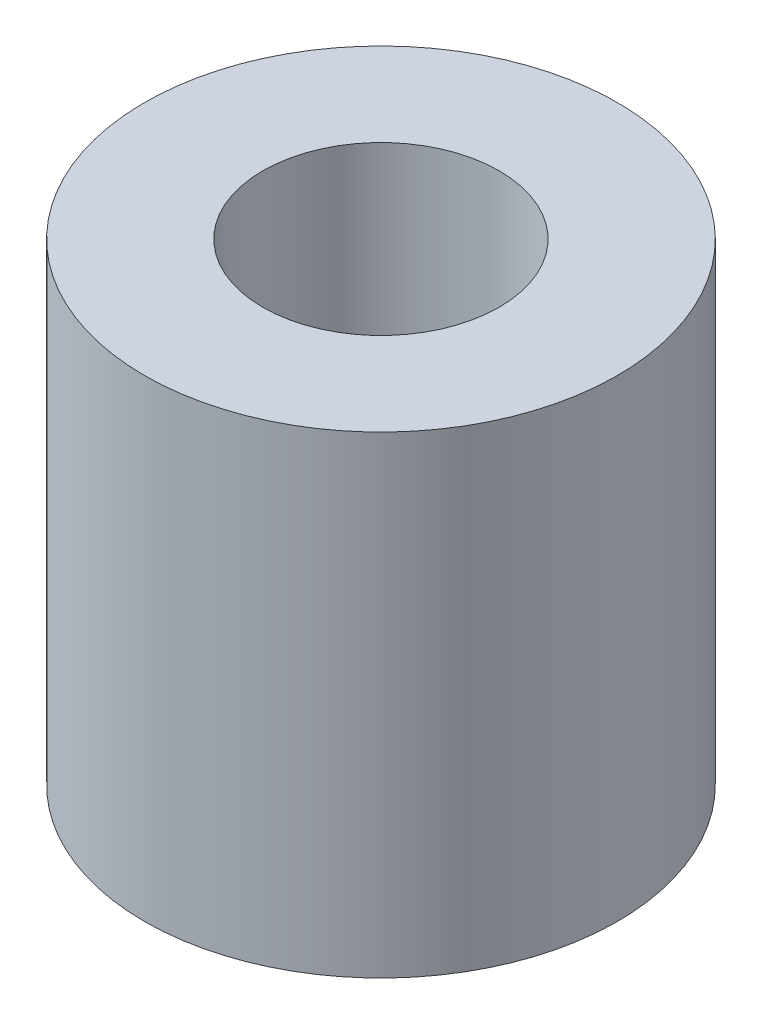
ISO-10303-21;
HEADER;
FILE_DESCRIPTION(('STEP AP214'),'2;1');
FILE_NAME('part.step','',(''),(''),'','','');
FILE_SCHEMA(('AUTOMOTIVE_DESIGN { 1 0 10303 214 1 1 1 1 }'));
ENDSEC;
DATA;
#1=APPLICATION_CONTEXT('core data for automotive mechanical design processes');
#2=APPLICATION_PROTOCOL_DEFINITION('international standard','automotive_design',2000,#1);
#3=PRODUCT_CONTEXT('',#1,'mechanical');
#4=PRODUCT('Part','Part','',(#3));
#5=PRODUCT_RELATED_PRODUCT_CATEGORY('part','',(#4));
#6=PRODUCT_DEFINITION_FORMATION('','',#4);
#7=PRODUCT_DEFINITION_CONTEXT('part definition',#1,'design');
#8=PRODUCT_DEFINITION('design','',#6,#7);
#9=PRODUCT_DEFINITION_SHAPE('','',#8);
#10=(LENGTH_UNIT() NAMED_UNIT(*) SI_UNIT(.MILLI.,.METRE.));
#11=(NAMED_UNIT(*) PLANE_ANGLE_UNIT() SI_UNIT($,.RADIAN.));
#12=(NAMED_UNIT(*) SI_UNIT($,.STERADIAN.) SOLID_ANGLE_UNIT());
#13=UNCERTAINTY_MEASURE_WITH_UNIT(LENGTH_MEASURE(1.E-05),#10,'distance_accuracy_value','');
#14=(GEOMETRIC_REPRESENTATION_CONTEXT(3) GLOBAL_UNCERTAINTY_ASSIGNED_CONTEXT((#13)) GLOBAL_UNIT_ASSIGNED_CONTEXT((#10,
#11,#12)) REPRESENTATION_CONTEXT('',''));
#15=CARTESIAN_POINT('',(0.,0.,0.));
#16=DIRECTION('',(0.,0.,1.));
#17=DIRECTION('',(1.,0.,0.));
#18=AXIS2_PLACEMENT_3D('',#15,#16,#17);
#19=CARTESIAN_POINT('',(0.,6.,0.));
#20=DIRECTION('',(0.,1.,0.));
#21=DIRECTION('',(0.,0.,1.));
#22=AXIS2_PLACEMENT_3D('',#19,#20,#21);
#23=PLANE('',#22);
#24=CARTESIAN_POINT('',(0.,6.,0.));
#25=DIRECTION('',(0.,1.,0.));
#26=DIRECTION('',(0.,0.,1.));
#27=AXIS2_PLACEMENT_3D('',#24,#25,#26);
#28=CIRCLE('',#27,3.);
#29=CARTESIAN_POINT('',(0.,6.,3.));
#30=VERTEX_POINT('',#29);
#31=EDGE_CURVE('E10',#30,#30,#28,.T.);
#32=ORIENTED_EDGE('',*,*,#31,.T.);
#33=EDGE_LOOP('',(#32));
#34=FACE_BOUND('',#33,.T.);
#35=CARTESIAN_POINT('',(0.,6.,0.));
#36=DIRECTION('',(0.,1.,0.));
#37=DIRECTION('',(0.,0.,1.));
#38=AXIS2_PLACEMENT_3D('',#35,#36,#37);
#39=CIRCLE('',#38,1.5);
#40=CARTESIAN_POINT('',(0.,6.,1.5));
#41=VERTEX_POINT('',#40);
#42=EDGE_CURVE('E42',#41,#41,#39,.T.);
#43=ORIENTED_EDGE('',*,*,#42,.F.);
#44=EDGE_LOOP('',(#43));
#45=FACE_BOUND('',#44,.T.);
#46=ADVANCED_FACE('F31',(#34,#45),#23,.T.);
#47=CARTESIAN_POINT('',(0.,0.,0.));
#48=DIRECTION('',(0.,1.,0.));
#49=DIRECTION('',(0.,0.,1.));
#50=AXIS2_PLACEMENT_3D('',#47,#48,#49);
#51=PLANE('',#50);
#52=CARTESIAN_POINT('',(0.,0.,0.));
#53=DIRECTION('',(0.,1.,0.));
#54=DIRECTION('',(0.,0.,1.));
#55=AXIS2_PLACEMENT_3D('',#52,#53,#54);
#56=CIRCLE('',#55,3.);
#57=CARTESIAN_POINT('',(0.,0.,3.));
#58=VERTEX_POINT('',#57);
#59=EDGE_CURVE('E35',#58,#58,#56,.T.);
#60=ORIENTED_EDGE('',*,*,#59,.F.);
#61=EDGE_LOOP('',(#60));
#62=FACE_BOUND('',#61,.T.);
#63=CARTESIAN_POINT('',(0.,0.,0.));
#64=DIRECTION('',(0.,1.,0.));
#65=DIRECTION('',(0.,0.,1.));
#66=AXIS2_PLACEMENT_3D('',#63,#64,#65);
#67=CIRCLE('',#66,1.5);
#68=CARTESIAN_POINT('',(0.,0.,1.5));
#69=VERTEX_POINT('',#68);
#70=EDGE_CURVE('E44',#69,#69,#67,.T.);
#71=ORIENTED_EDGE('',*,*,#70,.T.);
#72=EDGE_LOOP('',(#71));
#73=FACE_BOUND('',#72,.T.);
#74=ADVANCED_FACE('F54',(#62,#73),#51,.F.);
#75=CARTESIAN_POINT('',(0.,6.,0.));
#76=DIRECTION('',(0.,-1.,0.));
#77=DIRECTION('',(0.,0.,-1.));
#78=AXIS2_PLACEMENT_3D('',#75,#76,#77);
#79=CYLINDRICAL_SURFACE('',#78,3.);
#80=ORIENTED_EDGE('',*,*,#31,.F.);
#81=EDGE_LOOP('',(#80));
#82=FACE_BOUND('',#81,.T.);
#83=ORIENTED_EDGE('',*,*,#59,.T.);
#84=EDGE_LOOP('',(#83));
#85=FACE_BOUND('',#84,.T.);
#86=ADVANCED_FACE('F33',(#82,#85),#79,.T.);
#87=CARTESIAN_POINT('',(0.,6.,0.));
#88=DIRECTION('',(0.,-1.,0.));
#89=DIRECTION('',(0.,0.,-1.));
#90=AXIS2_PLACEMENT_3D('',#87,#88,#89);
#91=CYLINDRICAL_SURFACE('',#90,1.5);
#92=ORIENTED_EDGE('',*,*,#42,.T.);
#93=EDGE_LOOP('',(#92));
#94=FACE_BOUND('',#93,.T.);
#95=ORIENTED_EDGE('',*,*,#70,.F.);
#96=EDGE_LOOP('',(#95));
#97=FACE_BOUND('',#96,.T.);
#98=ADVANCED_FACE('F50',(#94,#97),#91,.F.);
#99=CLOSED_SHELL('',(#46,#74,#86,#98));
#100=MANIFOLD_SOLID_BREP('B2',#99);
#101=ADVANCED_BREP_SHAPE_REPRESENTATION('',(#18,#100),#14);
#102=SHAPE_DEFINITION_REPRESENTATION(#9,#101);
ENDSEC;
END-ISO-10303-21;
